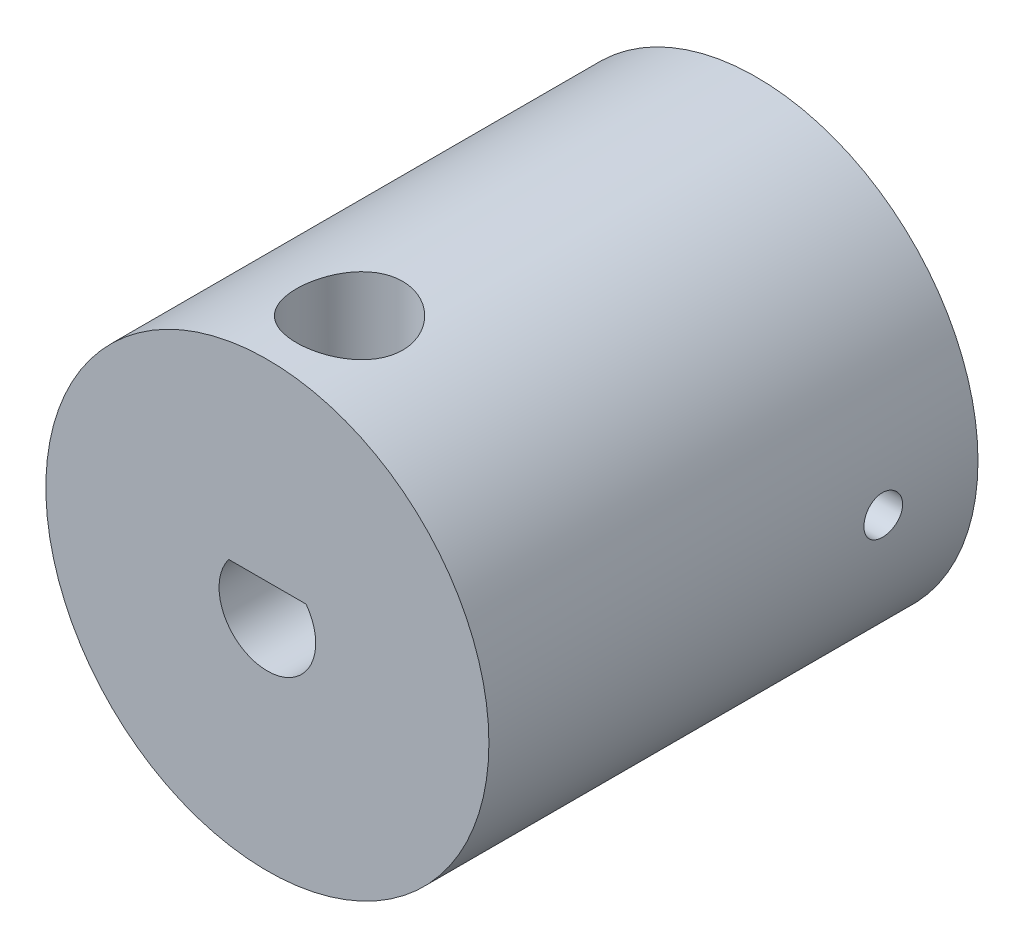
ISO-10303-21;
HEADER;
FILE_DESCRIPTION(('STEP AP214'),'2;1');
FILE_NAME('part.step','',(''),(''),'','','');
FILE_SCHEMA(('AUTOMOTIVE_DESIGN { 1 0 10303 214 1 1 1 1 }'));
ENDSEC;
DATA;
#1=APPLICATION_CONTEXT('core data for automotive mechanical design processes');
#2=APPLICATION_PROTOCOL_DEFINITION('international standard','automotive_design',2000,#1);
#3=PRODUCT_CONTEXT('',#1,'mechanical');
#4=PRODUCT('Part','Part','',(#3));
#5=PRODUCT_RELATED_PRODUCT_CATEGORY('part','',(#4));
#6=PRODUCT_DEFINITION_FORMATION('','',#4);
#7=PRODUCT_DEFINITION_CONTEXT('part definition',#1,'design');
#8=PRODUCT_DEFINITION('design','',#6,#7);
#9=PRODUCT_DEFINITION_SHAPE('','',#8);
#10=(LENGTH_UNIT() NAMED_UNIT(*) SI_UNIT(.MILLI.,.METRE.));
#11=(NAMED_UNIT(*) PLANE_ANGLE_UNIT() SI_UNIT($,.RADIAN.));
#12=(NAMED_UNIT(*) SI_UNIT($,.STERADIAN.) SOLID_ANGLE_UNIT());
#13=UNCERTAINTY_MEASURE_WITH_UNIT(LENGTH_MEASURE(1.E-05),#10,'distance_accuracy_value','');
#14=(GEOMETRIC_REPRESENTATION_CONTEXT(3) GLOBAL_UNCERTAINTY_ASSIGNED_CONTEXT((#13)) GLOBAL_UNIT_ASSIGNED_CONTEXT((#10,
#11,#12)) REPRESENTATION_CONTEXT('',''));
#15=CARTESIAN_POINT('',(0.,0.,0.));
#16=DIRECTION('',(0.,0.,1.));
#17=DIRECTION('',(1.,0.,0.));
#18=AXIS2_PLACEMENT_3D('',#15,#16,#17);
#19=CARTESIAN_POINT('',(0.,0.,0.));
#20=DIRECTION('',(0.,0.,1.));
#21=DIRECTION('',(1.,0.,0.));
#22=AXIS2_PLACEMENT_3D('',#19,#20,#21);
#23=PLANE('',#22);
#24=DIRECTION('',(1.,0.,0.));
#25=VECTOR('',#24,1.);
#26=CARTESIAN_POINT('',(0.,6.75,0.));
#27=LINE('',#26,#25);
#28=CARTESIAN_POINT('',(-6.75,6.75,0.));
#29=VERTEX_POINT('',#28);
#30=CARTESIAN_POINT('',(6.75,6.75,0.));
#31=VERTEX_POINT('',#30);
#32=EDGE_CURVE('E146',#29,#31,#27,.T.);
#33=ORIENTED_EDGE('',*,*,#32,.F.);
#34=DIRECTION('',(0.,1.,0.));
#35=VECTOR('',#34,1.);
#36=CARTESIAN_POINT('',(-6.75,0.,0.));
#37=LINE('',#36,#35);
#38=CARTESIAN_POINT('',(-6.75,-6.75,0.));
#39=VERTEX_POINT('',#38);
#40=EDGE_CURVE('E155',#39,#29,#37,.T.);
#41=ORIENTED_EDGE('',*,*,#40,.F.);
#42=DIRECTION('',(1.,0.,0.));
#43=VECTOR('',#42,1.);
#44=CARTESIAN_POINT('',(0.,-6.75,0.));
#45=LINE('',#44,#43);
#46=CARTESIAN_POINT('',(6.75,-6.75,0.));
#47=VERTEX_POINT('',#46);
#48=EDGE_CURVE('E152',#39,#47,#45,.T.);
#49=ORIENTED_EDGE('',*,*,#48,.T.);
#50=DIRECTION('',(0.,1.,0.));
#51=VECTOR('',#50,1.);
#52=CARTESIAN_POINT('',(6.75,0.,0.));
#53=LINE('',#52,#51);
#54=EDGE_CURVE('E149',#47,#31,#53,.T.);
#55=ORIENTED_EDGE('',*,*,#54,.T.);
#56=EDGE_LOOP('',(#33,#41,#49,#55));
#57=FACE_BOUND('',#56,.T.);
#58=CARTESIAN_POINT('',(0.,0.,0.));
#59=DIRECTION('',(0.,0.,1.));
#60=DIRECTION('',(1.,0.,0.));
#61=AXIS2_PLACEMENT_3D('',#58,#59,#60);
#62=CIRCLE('',#61,11.46);
#63=CARTESIAN_POINT('',(11.46,0.,0.));
#64=VERTEX_POINT('',#63);
#65=EDGE_CURVE('E157',#64,#64,#62,.T.);
#66=ORIENTED_EDGE('',*,*,#65,.F.);
#67=EDGE_LOOP('',(#66));
#68=FACE_BOUND('',#67,.T.);
#69=ADVANCED_FACE('F36',(#57,#68),#23,.F.);
#70=CARTESIAN_POINT('',(6.55999999999999,0.,4.9));
#71=DIRECTION('',(1.,0.,0.));
#72=DIRECTION('',(0.,1.,0.));
#73=AXIS2_PLACEMENT_3D('',#70,#71,#72);
#74=CYLINDRICAL_SURFACE('',#73,1.);
#75=CARTESIAN_POINT('',(6.75,0.,4.9));
#76=DIRECTION('',(-1.,0.,0.));
#77=DIRECTION('',(0.,0.,1.));
#78=AXIS2_PLACEMENT_3D('',#75,#76,#77);
#79=CIRCLE('',#78,1.);
#80=CARTESIAN_POINT('',(6.75,0.,5.9));
#81=VERTEX_POINT('',#80);
#82=EDGE_CURVE('E242',#81,#81,#79,.T.);
#83=ORIENTED_EDGE('',*,*,#82,.T.);
#84=EDGE_LOOP('',(#83));
#85=FACE_BOUND('',#84,.T.);
#86=CARTESIAN_POINT('',(11.416286611679,1.,4.9));
#87=CARTESIAN_POINT('',(11.416287189492,0.99999755555195,4.84394440415661));
#88=CARTESIAN_POINT('',(11.4167039189144,0.995270794654839,4.78785088702833));
#89=CARTESIAN_POINT('',(11.4183257462953,0.976484821992712,4.67721658299959));
#90=CARTESIAN_POINT('',(11.4195317321539,0.962415099292664,4.62267761713997));
#91=CARTESIAN_POINT('',(11.4225944488939,0.925353830254428,4.51677074132578));
#92=CARTESIAN_POINT('',(11.4244508051835,0.902367418817756,4.46540102597605));
#93=CARTESIAN_POINT('',(11.4286046313065,0.848134571645739,4.36726098693287));
#94=CARTESIAN_POINT('',(11.4309020082788,0.816889874249762,4.32048969812655));
#95=CARTESIAN_POINT('',(11.4356862416102,0.746932941670358,4.23273116389819));
#96=CARTESIAN_POINT('',(11.4381735548335,0.708202334600896,4.19175858722773));
#97=CARTESIAN_POINT('',(11.4430532281609,0.624411978553235,4.11688662856115));
#98=CARTESIAN_POINT('',(11.4454455840704,0.579351950377498,4.08298755874904));
#99=CARTESIAN_POINT('',(11.449870165888,0.484093724951364,4.0231755827602));
#100=CARTESIAN_POINT('',(11.4519018138034,0.433887480922054,3.99727544571044));
#101=CARTESIAN_POINT('',(11.4553711325992,0.32981806426848,3.95427822283963));
#102=CARTESIAN_POINT('',(11.4568088147693,0.275954961173598,3.93718096969872));
#103=CARTESIAN_POINT('',(11.4589250178322,0.166247414736415,3.91231727955866));
#104=CARTESIAN_POINT('',(11.4596054773553,0.110408410432879,3.90452701117137));
#105=CARTESIAN_POINT('',(11.4601371412034,-0.0017884349978142,3.89842474180476));
#106=CARTESIAN_POINT('',(11.4599883622846,-0.0581462656182291,3.90011254930482));
#107=CARTESIAN_POINT('',(11.4588799092057,-0.169619340253864,3.91289906333009));
#108=CARTESIAN_POINT('',(11.4579224432089,-0.224737548792702,3.9239721431572));
#109=CARTESIAN_POINT('',(11.4553068282155,-0.332330091226132,3.95517501384679));
#110=CARTESIAN_POINT('',(11.4536486720097,-0.384804397911479,3.97530489789459));
#111=CARTESIAN_POINT('',(11.4498143943135,-0.485700962293094,4.02407842337804));
#112=CARTESIAN_POINT('',(11.4476375771903,-0.534117658974887,4.0527335118433));
#113=CARTESIAN_POINT('',(11.4430105245841,-0.625463938971602,4.11773572204318));
#114=CARTESIAN_POINT('',(11.4405602830126,-0.668393400052432,4.15408301508208));
#115=CARTESIAN_POINT('',(11.4356520226757,-0.747696493693723,4.23358223453593));
#116=CARTESIAN_POINT('',(11.433194005205,-0.784047801456085,4.2767564344483));
#117=CARTESIAN_POINT('',(11.4285554257437,-0.848990152629913,4.36860637555881));
#118=CARTESIAN_POINT('',(11.4263748640152,-0.877581188711508,4.4172821219533));
#119=CARTESIAN_POINT('',(11.4225377342122,-0.926190714670685,4.51876943016104));
#120=CARTESIAN_POINT('',(11.4208812399183,-0.946207997638665,4.57158157300943));
#121=CARTESIAN_POINT('',(11.4182812658186,-0.977085022539308,4.67983483395992));
#122=CARTESIAN_POINT('',(11.417337769555,-0.987944975849185,4.73527589134799));
#123=CARTESIAN_POINT('',(11.4162733340854,-1.00017070568074,4.84701772171649));
#124=CARTESIAN_POINT('',(11.4161496957716,-1.00156763636396,4.90331506147091));
#125=CARTESIAN_POINT('',(11.4167318517598,-0.994909321181171,5.01534309455877));
#126=CARTESIAN_POINT('',(11.4174376375672,-0.986854172119757,5.07107379368962));
#127=CARTESIAN_POINT('',(11.4195966582067,-0.961546346209132,5.18029681643607));
#128=CARTESIAN_POINT('',(11.4210487079677,-0.94430825034689,5.23379254399447));
#129=CARTESIAN_POINT('',(11.4245356702083,-0.901138693775708,5.33713259921564));
#130=CARTESIAN_POINT('',(11.4265705929245,-0.875207080384899,5.38697686273001));
#131=CARTESIAN_POINT('',(11.4310005593263,-0.815307932310594,5.48174153474104));
#132=CARTESIAN_POINT('',(11.4333965263203,-0.78131966257433,5.52664879314471));
#133=CARTESIAN_POINT('',(11.4382755176524,-0.706301900567927,5.61013169926171));
#134=CARTESIAN_POINT('',(11.4407585436312,-0.66527227553341,5.64870722756377));
#135=CARTESIAN_POINT('',(11.4455399406991,-0.577201740382112,5.71853823585038));
#136=CARTESIAN_POINT('',(11.4478377894766,-0.5301447340673,5.74977345608099));
#137=CARTESIAN_POINT('',(11.4519823826858,-0.43143525935736,5.80389809704623));
#138=CARTESIAN_POINT('',(11.4538291319974,-0.379782840683361,5.82678760806555));
#139=CARTESIAN_POINT('',(11.4568610545227,-0.273420947774391,5.86353638981967));
#140=CARTESIAN_POINT('',(11.4580471405627,-0.218715807060787,5.87740812470256));
#141=CARTESIAN_POINT('',(11.4596278123338,-0.107742082388966,5.89576831100265));
#142=CARTESIAN_POINT('',(11.4600224146366,-0.0514735311896258,5.90025695887808));
#143=CARTESIAN_POINT('',(11.459975676238,0.0608302108092225,5.899721162706));
#144=CARTESIAN_POINT('',(11.4595371076263,0.11686555596414,5.89472826526011));
#145=CARTESIAN_POINT('',(11.4578787822898,0.227298545532609,5.87543697431781));
#146=CARTESIAN_POINT('',(11.456659024591,0.281696187903888,5.8611385692176));
#147=CARTESIAN_POINT('',(11.4535751335333,0.38731115104624,5.82365032623769));
#148=CARTESIAN_POINT('',(11.4517110471912,0.438528703547676,5.80046113710724));
#149=CARTESIAN_POINT('',(11.4475468774668,0.536348981816687,5.74585312400888));
#150=CARTESIAN_POINT('',(11.4452468000189,0.582951770383121,5.71443441205158));
#151=CARTESIAN_POINT('',(11.4404595809543,0.670381180491434,5.64414075350913));
#152=CARTESIAN_POINT('',(11.43797186775,0.711188963158802,5.60524241453659));
#153=CARTESIAN_POINT('',(11.4330946257533,0.785713656248015,5.52113707413777));
#154=CARTESIAN_POINT('',(11.4307051208344,0.819428850635932,5.47592855036932));
#155=CARTESIAN_POINT('',(11.4262896353799,0.878861681017481,5.38039019318671));
#156=CARTESIAN_POINT('',(11.4242643980553,0.904563043081026,5.33005021055623));
#157=CARTESIAN_POINT('',(11.4208157635229,0.94711523006824,5.22578547575773));
#158=CARTESIAN_POINT('',(11.4193916776144,0.963976188267943,5.17186490808165));
#159=CARTESIAN_POINT('',(11.4176712808666,0.984094252215102,5.08135747054555));
#160=CARTESIAN_POINT('',(11.4171544318456,0.990050930310134,5.04535197643267));
#161=CARTESIAN_POINT('',(11.4164619098538,0.99800459321858,4.97290300144196));
#162=CARTESIAN_POINT('',(11.4162862358594,1.00000158991098,4.93645952187841));
#163=CARTESIAN_POINT('',(11.416286611679,1.,4.9));
#164=B_SPLINE_CURVE_WITH_KNOTS('',3,(#86,#87,#88,#89,#90,#91,#92,#93,#94,#95,#96,#97,#98,#99,
#100,#101,#102,#103,#104,#105,#106,#107,#108,#109,#110,#111,#112,#113,#114,#115,#116,#117,#118,
#119,#120,#121,#122,#123,#124,#125,#126,#127,#128,#129,#130,#131,#132,#133,#134,#135,#136,#137,
#138,#139,#140,#141,#142,#143,#144,#145,#146,#147,#148,#149,#150,#151,#152,#153,#154,#155,#156,
#157,#158,#159,#160,#161,#162,#163),.UNSPECIFIED.,.T.,.F.,(4,2,2,2,2,2,2,2,2,2,2,2,2,2,2,2,2,2,
2,2,2,2,2,2,2,2,2,2,2,2,2,2,2,2,2,2,2,2,4),(0.,0.168033661990981,0.336256684697046,
0.504382975379723,0.672473904231141,0.840982722888629,1.00949897698602,1.17828286850597,
1.34706355176587,1.51541112391928,1.68375529433607,1.85164127256805,2.01952897821598,
2.18764313665898,2.35576103937379,2.52443921328088,2.69311754651035,2.8618196164446,
3.03051779214862,3.19866030867447,3.36680110316385,3.53467571044538,3.70255326621718,
3.87086766388907,4.03918523546866,4.2079620574833,4.3767370536,4.54527827427787,
4.71381596609143,4.88179388862446,5.04977202062306,5.21773789780194,5.38570148894502,
5.55419918763852,5.72273760715848,5.89161608660896,6.06030056426115,6.16959287063602,
6.27888484913512),.UNSPECIFIED.);
#165=CARTESIAN_POINT('',(11.416286611679,1.,4.9));
#166=VERTEX_POINT('',#165);
#167=EDGE_CURVE('E40',#166,#166,#164,.T.);
#168=ORIENTED_EDGE('',*,*,#167,.F.);
#169=EDGE_LOOP('',(#168));
#170=FACE_BOUND('',#169,.T.);
#171=ADVANCED_FACE('F197',(#85,#170),#74,.F.);
#172=CARTESIAN_POINT('',(2.,1.5,25.3));
#173=DIRECTION('',(0.,-1.,0.));
#174=DIRECTION('',(0.,0.,-1.));
#175=AXIS2_PLACEMENT_3D('',#172,#173,#174);
#176=PLANE('',#175);
#177=CARTESIAN_POINT('',(0.,1.5,21.05));
#178=DIRECTION('',(0.,-1.,0.));
#179=DIRECTION('',(0.,0.,-1.));
#180=AXIS2_PLACEMENT_3D('',#177,#178,#179);
#181=CIRCLE('',#180,2.75);
#182=CARTESIAN_POINT('',(2.,1.5,22.9374586088177));
#183=VERTEX_POINT('',#182);
#184=CARTESIAN_POINT('',(-2.,1.5,22.9374586088177));
#185=VERTEX_POINT('',#184);
#186=EDGE_CURVE('E11',#183,#185,#181,.T.);
#187=ORIENTED_EDGE('',*,*,#186,.F.);
#188=DIRECTION('',(0.,0.,-1.));
#189=VECTOR('',#188,1.);
#190=CARTESIAN_POINT('',(2.,1.5,25.3));
#191=LINE('',#190,#189);
#192=CARTESIAN_POINT('',(2.,1.5,25.3));
#193=VERTEX_POINT('',#192);
#194=EDGE_CURVE('E127',#193,#183,#191,.T.);
#195=ORIENTED_EDGE('',*,*,#194,.F.);
#196=DIRECTION('',(-1.,0.,0.));
#197=VECTOR('',#196,1.);
#198=CARTESIAN_POINT('',(2.,1.5,25.3));
#199=LINE('',#198,#197);
#200=CARTESIAN_POINT('',(-2.,1.5,25.3));
#201=VERTEX_POINT('',#200);
#202=EDGE_CURVE('E238',#193,#201,#199,.T.);
#203=ORIENTED_EDGE('',*,*,#202,.T.);
#204=DIRECTION('',(0.,0.,-1.));
#205=VECTOR('',#204,1.);
#206=CARTESIAN_POINT('',(-2.,1.5,25.3));
#207=LINE('',#206,#205);
#208=EDGE_CURVE('E125',#201,#185,#207,.T.);
#209=ORIENTED_EDGE('',*,*,#208,.T.);
#210=EDGE_LOOP('',(#187,#195,#203,#209));
#211=FACE_BOUND('',#210,.T.);
#212=ADVANCED_FACE('F202',(#211),#176,.T.);
#213=CARTESIAN_POINT('',(0.,0.,9.8));
#214=DIRECTION('',(0.,0.,-1.));
#215=DIRECTION('',(-1.,0.,0.));
#216=AXIS2_PLACEMENT_3D('',#213,#214,#215);
#217=CYLINDRICAL_SURFACE('',#216,11.46);
#218=ORIENTED_EDGE('',*,*,#65,.T.);
#219=EDGE_LOOP('',(#218));
#220=FACE_BOUND('',#219,.T.);
#221=CARTESIAN_POINT('',(0.,11.46,18.3));
#222=CARTESIAN_POINT('',(0.152134266410478,11.459997315202,18.3000046065268));
#223=CARTESIAN_POINT('',(0.30432131631409,11.4569401841527,18.3126669869507));
#224=CARTESIAN_POINT('',(0.604346669926077,11.4450405718406,18.3629139177978));
#225=CARTESIAN_POINT('',(0.752182235808576,11.436194526369,18.4005138223357));
#226=CARTESIAN_POINT('',(1.03912755130145,11.4136984547343,18.4993699020821));
#227=CARTESIAN_POINT('',(1.17824711626712,11.4000539511446,18.560598890294));
#228=CARTESIAN_POINT('',(1.44423826126717,11.3694205804812,18.7048824733902));
#229=CARTESIAN_POINT('',(1.57110966698507,11.3524316658202,18.7879373788395));
#230=CARTESIAN_POINT('',(1.81142605683263,11.3165969192095,18.975190623584));
#231=CARTESIAN_POINT('',(1.92460390558693,11.2977242697524,19.0797266879447));
#232=CARTESIAN_POINT('',(2.13200048801444,11.2604308145264,19.3062511265386));
#233=CARTESIAN_POINT('',(2.22621724043526,11.2420100561521,19.4282413222846));
#234=CARTESIAN_POINT('',(2.39424738829815,11.2074377908403,19.6882522178425));
#235=CARTESIAN_POINT('',(2.46776679509951,11.1913204414581,19.8264678578236));
#236=CARTESIAN_POINT('',(2.59042635445575,11.1635690034222,20.1137446377009));
#237=CARTESIAN_POINT('',(2.63957007000842,11.151934259601,20.2628041888866));
#238=CARTESIAN_POINT('',(2.71118139114424,11.1347402068298,20.5646129017539));
#239=CARTESIAN_POINT('',(2.7341269203305,11.12907220387,20.7172423322758));
#240=CARTESIAN_POINT('',(2.75417835147851,11.1241276838068,21.0242813845913));
#241=CARTESIAN_POINT('',(2.75128810792076,11.1248502132896,21.1786907374026));
#242=CARTESIAN_POINT('',(2.72013244569873,11.1325071756296,21.4812810901047));
#243=CARTESIAN_POINT('',(2.69243164644204,11.1393033809249,21.629524263615));
#244=CARTESIAN_POINT('',(2.61333982291657,11.1581222363667,21.9191955559348));
#245=CARTESIAN_POINT('',(2.56194722984818,11.1701452326125,22.0606232227568));
#246=CARTESIAN_POINT('',(2.43643718479129,11.1981929531958,22.334187289325));
#247=CARTESIAN_POINT('',(2.36211077281569,11.2142542118799,22.4662239164691));
#248=CARTESIAN_POINT('',(2.19298932900795,11.2485475515743,22.7161555320851));
#249=CARTESIAN_POINT('',(2.09819097687711,11.2667799845073,22.8340482217525));
#250=CARTESIAN_POINT('',(1.88787045280675,11.303947087652,23.0555862793156));
#251=CARTESIAN_POINT('',(1.7718705491305,11.3228876435611,23.158777647159));
#252=CARTESIAN_POINT('',(1.52398869042243,11.358904875474,23.3443248809528));
#253=CARTESIAN_POINT('',(1.39210632252466,11.3759815030028,23.4266802050958));
#254=CARTESIAN_POINT('',(1.11558686657263,11.4064212432114,23.5683657647362));
#255=CARTESIAN_POINT('',(0.970913138975854,11.4197732011836,23.6276270437532));
#256=CARTESIAN_POINT('',(0.673266738353864,11.4411776221249,23.7208653621216));
#257=CARTESIAN_POINT('',(0.520295529625966,11.4492310168852,23.7548468472476));
#258=CARTESIAN_POINT('',(0.214282251530026,11.4589947736493,23.7958787052093));
#259=CARTESIAN_POINT('',(0.0613276946205946,11.4608508692608,23.8035479493115));
#260=CARTESIAN_POINT('',(-0.243678301820923,11.4584237321923,23.793428333761));
#261=CARTESIAN_POINT('',(-0.395729814822905,11.4541410060205,23.7756415744588));
#262=CARTESIAN_POINT('',(-0.692496427967244,11.4400103688491,23.7156261522956));
#263=CARTESIAN_POINT('',(-0.837282867145973,11.4302383839354,23.67373076505));
#264=CARTESIAN_POINT('',(-1.11776827705684,11.406227521074,23.5670644093101));
#265=CARTESIAN_POINT('',(-1.25346637239608,11.3919882135808,23.5022912409777));
#266=CARTESIAN_POINT('',(-1.51441800632489,11.3602692870292,23.350478720106));
#267=CARTESIAN_POINT('',(-1.6394603703731,11.3427397282033,23.2630870571594));
#268=CARTESIAN_POINT('',(-1.87332589725037,11.3064706918125,23.0689730369554));
#269=CARTESIAN_POINT('',(-1.98214648833566,11.2877310230745,22.9622476205204));
#270=CARTESIAN_POINT('',(-2.18299577663015,11.2506361774363,22.7296322985811));
#271=CARTESIAN_POINT('',(-2.27459204781973,11.2322991112796,22.6033655410837));
#272=CARTESIAN_POINT('',(-2.43528946134512,11.1985594586213,22.3368837736809));
#273=CARTESIAN_POINT('',(-2.50439161092181,11.1831567407384,22.1966693886889));
#274=CARTESIAN_POINT('',(-2.61763559019949,11.1571932385852,21.9070367475671));
#275=CARTESIAN_POINT('',(-2.66192464041769,11.1466039675796,21.7576787381456));
#276=CARTESIAN_POINT('',(-2.72469039265914,11.1314295739516,21.45334713442));
#277=CARTESIAN_POINT('',(-2.7431722167249,11.1268432599144,21.2983746607027));
#278=CARTESIAN_POINT('',(-2.75354739295511,11.1242797193674,20.9915993175185));
#279=CARTESIAN_POINT('',(-2.74612988921072,11.1261311871696,20.8398207976387));
#280=CARTESIAN_POINT('',(-2.70648194713221,11.1358414171946,20.5397458867624));
#281=CARTESIAN_POINT('',(-2.67425193373351,11.143700076539,20.3914494361773));
#282=CARTESIAN_POINT('',(-2.58625626410711,11.1644476225638,20.1032300290844));
#283=CARTESIAN_POINT('',(-2.53061021537816,11.177310921051,19.9632685883735));
#284=CARTESIAN_POINT('',(-2.39745853718641,11.2066239070282,19.6945728639783));
#285=CARTESIAN_POINT('',(-2.3199501178427,11.2230740521786,19.5658400159337));
#286=CARTESIAN_POINT('',(-2.14307168892753,11.2582034891971,19.3199027796895));
#287=CARTESIAN_POINT('',(-2.04321908230242,11.2769270085344,19.2030517312015));
#288=CARTESIAN_POINT('',(-1.82543999683844,11.3142189765288,18.9875394987931));
#289=CARTESIAN_POINT('',(-1.70750927931068,11.3327873877389,18.8888825927491));
#290=CARTESIAN_POINT('',(-1.45459863929797,11.3680380853183,18.7109974339427));
#291=CARTESIAN_POINT('',(-1.31937184119898,11.3846846365431,18.6321126063125));
#292=CARTESIAN_POINT('',(-1.03719451166678,11.4138459113534,18.4983205038828));
#293=CARTESIAN_POINT('',(-0.890252969829236,11.4263637660125,18.4433950488046));
#294=CARTESIAN_POINT('',(-0.619522580600244,11.4438766229267,18.3677889465071));
#295=CARTESIAN_POINT('',(-0.497086661983845,11.4498827561834,18.3424208082768));
#296=CARTESIAN_POINT('',(-0.249778918926152,11.4579454212019,18.3085249798132));
#297=CARTESIAN_POINT('',(-0.12490725001152,11.4600022043077,18.2999962178896));
#298=CARTESIAN_POINT('',(0.,11.46,18.3));
#299=B_SPLINE_CURVE_WITH_KNOTS('',3,(#221,#222,#223,#224,#225,#226,#227,#228,#229,#230,#231,
#232,#233,#234,#235,#236,#237,#238,#239,#240,#241,#242,#243,#244,#245,#246,#247,#248,#249,#250,
#251,#252,#253,#254,#255,#256,#257,#258,#259,#260,#261,#262,#263,#264,#265,#266,#267,#268,#269,
#270,#271,#272,#273,#274,#275,#276,#277,#278,#279,#280,#281,#282,#283,#284,#285,#286,#287,#288,
#289,#290,#291,#292,#293,#294,#295,#296,#297,#298),.UNSPECIFIED.,.T.,.F.,(4,2,2,2,2,2,2,2,2,2,2,
2,2,2,2,2,2,2,2,2,2,2,2,2,2,2,2,2,2,2,2,2,2,2,2,2,2,2,4),(0.,0.455945241535018,
0.912171470970431,1.36787433614396,1.82358368594973,2.28709708102779,2.75065888368449,
3.22050648638909,3.69028539115766,4.1513500439527,4.61234591091862,5.0631100901209,
5.51390412186497,5.96893328392957,6.42403630166871,6.89105842735451,7.3580926959403,
7.82651098797521,8.2948468831853,8.75208893360838,9.20929325960353,9.66032407457753,
10.1113982707261,10.5699724229617,11.0286191988154,11.4975753329284,11.9665104652531,
12.4326330307989,12.8986630703562,13.3523882879279,13.8061057352405,14.257533229909,
14.7090183578142,15.1714029718689,15.6338961653395,16.103938738248,16.5736240216154,
16.9479939280802,17.3223400081561),.UNSPECIFIED.);
#300=CARTESIAN_POINT('',(0.,11.46,18.3));
#301=VERTEX_POINT('',#300);
#302=EDGE_CURVE('E117',#301,#301,#299,.T.);
#303=ORIENTED_EDGE('',*,*,#302,.T.);
#304=EDGE_LOOP('',(#303));
#305=FACE_BOUND('',#304,.T.);
#306=CARTESIAN_POINT('',(0.,0.,25.3));
#307=DIRECTION('',(0.,0.,1.));
#308=DIRECTION('',(1.,0.,0.));
#309=AXIS2_PLACEMENT_3D('',#306,#307,#308);
#310=CIRCLE('',#309,11.46);
#311=CARTESIAN_POINT('',(11.46,0.,25.3));
#312=VERTEX_POINT('',#311);
#313=EDGE_CURVE('E216',#312,#312,#310,.T.);
#314=ORIENTED_EDGE('',*,*,#313,.F.);
#315=EDGE_LOOP('',(#314));
#316=FACE_BOUND('',#315,.T.);
#317=ORIENTED_EDGE('',*,*,#167,.T.);
#318=EDGE_LOOP('',(#317));
#319=FACE_BOUND('',#318,.T.);
#320=ADVANCED_FACE('F205',(#220,#305,#316,#319),#217,.T.);
#321=CARTESIAN_POINT('',(0.,6.75,9.8));
#322=DIRECTION('',(0.,1.,0.));
#323=DIRECTION('',(0.,0.,1.));
#324=AXIS2_PLACEMENT_3D('',#321,#322,#323);
#325=PLANE('',#324);
#326=ORIENTED_EDGE('',*,*,#32,.T.);
#327=DIRECTION('',(0.,0.,-1.));
#328=VECTOR('',#327,1.);
#329=CARTESIAN_POINT('',(6.75,6.75,9.8));
#330=LINE('',#329,#328);
#331=CARTESIAN_POINT('',(6.75,6.75,14.8));
#332=VERTEX_POINT('',#331);
#333=EDGE_CURVE('E112',#332,#31,#330,.T.);
#334=ORIENTED_EDGE('',*,*,#333,.F.);
#335=DIRECTION('',(1.,0.,0.));
#336=VECTOR('',#335,1.);
#337=CARTESIAN_POINT('',(6.75,6.75,14.8));
#338=LINE('',#337,#336);
#339=CARTESIAN_POINT('',(-6.75,6.75,14.8));
#340=VERTEX_POINT('',#339);
#341=EDGE_CURVE('E137',#340,#332,#338,.T.);
#342=ORIENTED_EDGE('',*,*,#341,.F.);
#343=DIRECTION('',(0.,0.,-1.));
#344=VECTOR('',#343,1.);
#345=CARTESIAN_POINT('',(-6.75,6.75,9.8));
#346=LINE('',#345,#344);
#347=EDGE_CURVE('E160',#340,#29,#346,.T.);
#348=ORIENTED_EDGE('',*,*,#347,.T.);
#349=EDGE_LOOP('',(#326,#334,#342,#348));
#350=FACE_BOUND('',#349,.T.);
#351=ADVANCED_FACE('F38',(#350),#325,.F.);
#352=CARTESIAN_POINT('',(6.75,0.,9.8));
#353=DIRECTION('',(-1.,0.,0.));
#354=DIRECTION('',(0.,0.,1.));
#355=AXIS2_PLACEMENT_3D('',#352,#353,#354);
#356=PLANE('',#355);
#357=ORIENTED_EDGE('',*,*,#82,.F.);
#358=EDGE_LOOP('',(#357));
#359=FACE_BOUND('',#358,.T.);
#360=ORIENTED_EDGE('',*,*,#54,.F.);
#361=DIRECTION('',(0.,0.,-1.));
#362=VECTOR('',#361,1.);
#363=CARTESIAN_POINT('',(6.75,-6.75,9.8));
#364=LINE('',#363,#362);
#365=CARTESIAN_POINT('',(6.75,-6.75,14.8));
#366=VERTEX_POINT('',#365);
#367=EDGE_CURVE('E165',#366,#47,#364,.T.);
#368=ORIENTED_EDGE('',*,*,#367,.F.);
#369=DIRECTION('',(0.,-1.,0.));
#370=VECTOR('',#369,1.);
#371=CARTESIAN_POINT('',(6.75,-6.75,14.8));
#372=LINE('',#371,#370);
#373=EDGE_CURVE('E140',#332,#366,#372,.T.);
#374=ORIENTED_EDGE('',*,*,#373,.F.);
#375=ORIENTED_EDGE('',*,*,#333,.T.);
#376=EDGE_LOOP('',(#360,#368,#374,#375));
#377=FACE_BOUND('',#376,.T.);
#378=ADVANCED_FACE('F170',(#359,#377),#356,.T.);
#379=CARTESIAN_POINT('',(0.,-6.75,9.8));
#380=DIRECTION('',(0.,1.,0.));
#381=DIRECTION('',(0.,0.,1.));
#382=AXIS2_PLACEMENT_3D('',#379,#380,#381);
#383=PLANE('',#382);
#384=ORIENTED_EDGE('',*,*,#48,.F.);
#385=DIRECTION('',(0.,0.,-1.));
#386=VECTOR('',#385,1.);
#387=CARTESIAN_POINT('',(-6.75,-6.75,9.8));
#388=LINE('',#387,#386);
#389=CARTESIAN_POINT('',(-6.75,-6.75,14.8));
#390=VERTEX_POINT('',#389);
#391=EDGE_CURVE('E163',#390,#39,#388,.T.);
#392=ORIENTED_EDGE('',*,*,#391,.F.);
#393=DIRECTION('',(-1.,0.,0.));
#394=VECTOR('',#393,1.);
#395=CARTESIAN_POINT('',(6.75,-6.75,14.8));
#396=LINE('',#395,#394);
#397=EDGE_CURVE('E143',#366,#390,#396,.T.);
#398=ORIENTED_EDGE('',*,*,#397,.F.);
#399=ORIENTED_EDGE('',*,*,#367,.T.);
#400=EDGE_LOOP('',(#384,#392,#398,#399));
#401=FACE_BOUND('',#400,.T.);
#402=ADVANCED_FACE('F179',(#401),#383,.T.);
#403=CARTESIAN_POINT('',(-6.75,0.,9.8));
#404=DIRECTION('',(-1.,0.,0.));
#405=DIRECTION('',(0.,0.,1.));
#406=AXIS2_PLACEMENT_3D('',#403,#404,#405);
#407=PLANE('',#406);
#408=ORIENTED_EDGE('',*,*,#40,.T.);
#409=ORIENTED_EDGE('',*,*,#347,.F.);
#410=DIRECTION('',(0.,1.,0.));
#411=VECTOR('',#410,1.);
#412=CARTESIAN_POINT('',(-6.75,-6.75,14.8));
#413=LINE('',#412,#411);
#414=EDGE_CURVE('E131',#390,#340,#413,.T.);
#415=ORIENTED_EDGE('',*,*,#414,.F.);
#416=ORIENTED_EDGE('',*,*,#391,.T.);
#417=EDGE_LOOP('',(#408,#409,#415,#416));
#418=FACE_BOUND('',#417,.T.);
#419=ADVANCED_FACE('F185',(#418),#407,.F.);
#420=CARTESIAN_POINT('',(0.,0.,14.8));
#421=DIRECTION('',(0.,0.,1.));
#422=DIRECTION('',(1.,0.,0.));
#423=AXIS2_PLACEMENT_3D('',#420,#421,#422);
#424=PLANE('',#423);
#425=ORIENTED_EDGE('',*,*,#414,.T.);
#426=ORIENTED_EDGE('',*,*,#341,.T.);
#427=ORIENTED_EDGE('',*,*,#373,.T.);
#428=ORIENTED_EDGE('',*,*,#397,.T.);
#429=EDGE_LOOP('',(#425,#426,#427,#428));
#430=FACE_BOUND('',#429,.T.);
#431=ADVANCED_FACE('F183',(#430),#424,.F.);
#432=CARTESIAN_POINT('',(0.,0.,16.8));
#433=DIRECTION('',(0.,0.,1.));
#434=DIRECTION('',(1.,0.,0.));
#435=AXIS2_PLACEMENT_3D('',#432,#433,#434);
#436=PLANE('',#435);
#437=CARTESIAN_POINT('',(0.,0.,16.8));
#438=DIRECTION('',(0.,0.,1.));
#439=DIRECTION('',(1.,0.,0.));
#440=AXIS2_PLACEMENT_3D('',#437,#438,#439);
#441=CIRCLE('',#440,2.5);
#442=CARTESIAN_POINT('',(-2.,1.5,16.8));
#443=VERTEX_POINT('',#442);
#444=CARTESIAN_POINT('',(2.,1.5,16.8));
#445=VERTEX_POINT('',#444);
#446=EDGE_CURVE('E244',#443,#445,#441,.T.);
#447=ORIENTED_EDGE('',*,*,#446,.T.);
#448=DIRECTION('',(-1.,0.,0.));
#449=VECTOR('',#448,1.);
#450=CARTESIAN_POINT('',(2.,1.5,16.8));
#451=LINE('',#450,#449);
#452=EDGE_CURVE('E121',#445,#443,#451,.T.);
#453=ORIENTED_EDGE('',*,*,#452,.T.);
#454=EDGE_LOOP('',(#447,#453));
#455=FACE_BOUND('',#454,.T.);
#456=ADVANCED_FACE('F192',(#455),#436,.T.);
#457=CARTESIAN_POINT('',(0.,0.,25.3));
#458=DIRECTION('',(0.,0.,-1.));
#459=DIRECTION('',(-1.,0.,0.));
#460=AXIS2_PLACEMENT_3D('',#457,#458,#459);
#461=CYLINDRICAL_SURFACE('',#460,2.5);
#462=ORIENTED_EDGE('',*,*,#446,.F.);
#463=CARTESIAN_POINT('',(-2.,1.5,19.1625413911823));
#464=VERTEX_POINT('',#463);
#465=EDGE_CURVE('E64',#464,#443,#207,.T.);
#466=ORIENTED_EDGE('',*,*,#465,.F.);
#467=EDGE_CURVE('E253',#185,#464,#207,.T.);
#468=ORIENTED_EDGE('',*,*,#467,.F.);
#469=ORIENTED_EDGE('',*,*,#208,.F.);
#470=CARTESIAN_POINT('',(0.,0.,25.3));
#471=DIRECTION('',(0.,0.,1.));
#472=DIRECTION('',(1.,0.,0.));
#473=AXIS2_PLACEMENT_3D('',#470,#471,#472);
#474=CIRCLE('',#473,2.5);
#475=EDGE_CURVE('E248',#201,#193,#474,.T.);
#476=ORIENTED_EDGE('',*,*,#475,.T.);
#477=ORIENTED_EDGE('',*,*,#194,.T.);
#478=CARTESIAN_POINT('',(2.,1.5,19.1625413911823));
#479=VERTEX_POINT('',#478);
#480=EDGE_CURVE('E116',#183,#479,#191,.T.);
#481=ORIENTED_EDGE('',*,*,#480,.T.);
#482=EDGE_CURVE('E119',#479,#445,#191,.T.);
#483=ORIENTED_EDGE('',*,*,#482,.T.);
#484=EDGE_LOOP('',(#462,#466,#468,#469,#476,#477,#481,#483));
#485=FACE_BOUND('',#484,.T.);
#486=ADVANCED_FACE('F129',(#485),#461,.F.);
#487=EDGE_CURVE('E50',#464,#479,#181,.T.);
#488=ORIENTED_EDGE('',*,*,#487,.F.);
#489=ORIENTED_EDGE('',*,*,#465,.T.);
#490=ORIENTED_EDGE('',*,*,#452,.F.);
#491=ORIENTED_EDGE('',*,*,#482,.F.);
#492=EDGE_LOOP('',(#488,#489,#490,#491));
#493=FACE_BOUND('',#492,.T.);
#494=ADVANCED_FACE('F120',(#493),#176,.T.);
#495=CARTESIAN_POINT('',(0.,0.,25.3));
#496=DIRECTION('',(0.,0.,1.));
#497=DIRECTION('',(1.,0.,0.));
#498=AXIS2_PLACEMENT_3D('',#495,#496,#497);
#499=PLANE('',#498);
#500=ORIENTED_EDGE('',*,*,#202,.F.);
#501=ORIENTED_EDGE('',*,*,#475,.F.);
#502=EDGE_LOOP('',(#500,#501));
#503=FACE_BOUND('',#502,.T.);
#504=ORIENTED_EDGE('',*,*,#313,.T.);
#505=EDGE_LOOP('',(#504));
#506=FACE_BOUND('',#505,.T.);
#507=ADVANCED_FACE('F226',(#503,#506),#499,.T.);
#508=CARTESIAN_POINT('',(0.,1.5,21.05));
#509=DIRECTION('',(0.,-1.,0.));
#510=DIRECTION('',(0.,0.,-1.));
#511=AXIS2_PLACEMENT_3D('',#508,#509,#510);
#512=PLANE('',#511);
#513=ORIENTED_EDGE('',*,*,#467,.T.);
#514=CARTESIAN_POINT('',(0.,1.5,21.05));
#515=DIRECTION('',(0.,-1.,0.));
#516=DIRECTION('',(0.,0.,-1.));
#517=AXIS2_PLACEMENT_3D('',#514,#515,#516);
#518=CIRCLE('',#517,2.75);
#519=EDGE_CURVE('E56',#185,#464,#518,.T.);
#520=ORIENTED_EDGE('',*,*,#519,.F.);
#521=EDGE_LOOP('',(#513,#520));
#522=FACE_BOUND('',#521,.T.);
#523=ADVANCED_FACE('F221',(#522),#512,.F.);
#524=CARTESIAN_POINT('',(0.,15.,21.05));
#525=DIRECTION('',(0.,-1.,0.));
#526=DIRECTION('',(0.,0.,-1.));
#527=AXIS2_PLACEMENT_3D('',#524,#525,#526);
#528=CYLINDRICAL_SURFACE('',#527,2.75);
#529=EDGE_CURVE('E109',#479,#183,#518,.T.);
#530=ORIENTED_EDGE('',*,*,#529,.T.);
#531=ORIENTED_EDGE('',*,*,#186,.T.);
#532=ORIENTED_EDGE('',*,*,#519,.T.);
#533=ORIENTED_EDGE('',*,*,#487,.T.);
#534=EDGE_LOOP('',(#530,#531,#532,#533));
#535=FACE_BOUND('',#534,.T.);
#536=ORIENTED_EDGE('',*,*,#302,.F.);
#537=EDGE_LOOP('',(#536));
#538=FACE_BOUND('',#537,.T.);
#539=ADVANCED_FACE('F107',(#535,#538),#528,.F.);
#540=ORIENTED_EDGE('',*,*,#480,.F.);
#541=ORIENTED_EDGE('',*,*,#529,.F.);
#542=EDGE_LOOP('',(#540,#541));
#543=FACE_BOUND('',#542,.T.);
#544=ADVANCED_FACE('F114',(#543),#512,.F.);
#545=CLOSED_SHELL('',(#69,#171,#212,#320,#351,#378,#402,#419,#431,#456,#486,#494,#507,#523,#539,#544));
#546=MANIFOLD_SOLID_BREP('B2',#545);
#547=ADVANCED_BREP_SHAPE_REPRESENTATION('',(#18,#546),#14);
#548=SHAPE_DEFINITION_REPRESENTATION(#9,#547);
ENDSEC;
END-ISO-10303-21;
